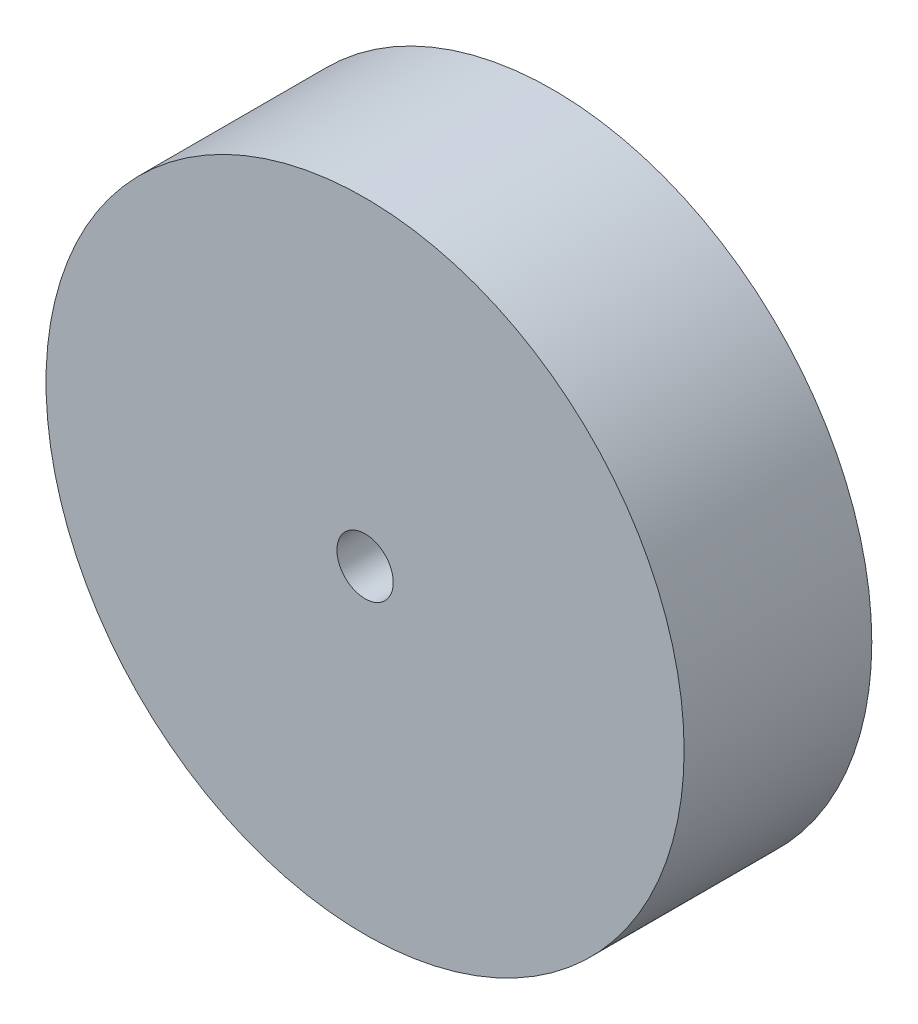
ISO-10303-21;
HEADER;
FILE_DESCRIPTION(('STEP AP214'),'2;1');
FILE_NAME('part.step','',(''),(''),'','','');
FILE_SCHEMA(('AUTOMOTIVE_DESIGN { 1 0 10303 214 1 1 1 1 }'));
ENDSEC;
DATA;
#1=APPLICATION_CONTEXT('core data for automotive mechanical design processes');
#2=APPLICATION_PROTOCOL_DEFINITION('international standard','automotive_design',2000,#1);
#3=PRODUCT_CONTEXT('',#1,'mechanical');
#4=PRODUCT('Part','Part','',(#3));
#5=PRODUCT_RELATED_PRODUCT_CATEGORY('part','',(#4));
#6=PRODUCT_DEFINITION_FORMATION('','',#4);
#7=PRODUCT_DEFINITION_CONTEXT('part definition',#1,'design');
#8=PRODUCT_DEFINITION('design','',#6,#7);
#9=PRODUCT_DEFINITION_SHAPE('','',#8);
#10=(LENGTH_UNIT() NAMED_UNIT(*) SI_UNIT(.MILLI.,.METRE.));
#11=(NAMED_UNIT(*) PLANE_ANGLE_UNIT() SI_UNIT($,.RADIAN.));
#12=(NAMED_UNIT(*) SI_UNIT($,.STERADIAN.) SOLID_ANGLE_UNIT());
#13=UNCERTAINTY_MEASURE_WITH_UNIT(LENGTH_MEASURE(1.E-05),#10,'distance_accuracy_value','');
#14=(GEOMETRIC_REPRESENTATION_CONTEXT(3) GLOBAL_UNCERTAINTY_ASSIGNED_CONTEXT((#13)) GLOBAL_UNIT_ASSIGNED_CONTEXT((#10,
#11,#12)) REPRESENTATION_CONTEXT('',''));
#15=CARTESIAN_POINT('',(0.,0.,0.));
#16=DIRECTION('',(0.,0.,1.));
#17=DIRECTION('',(1.,0.,0.));
#18=AXIS2_PLACEMENT_3D('',#15,#16,#17);
#19=CARTESIAN_POINT('',(0.,0.,10.));
#20=DIRECTION('',(0.,0.,1.));
#21=DIRECTION('',(1.,0.,0.));
#22=AXIS2_PLACEMENT_3D('',#19,#20,#21);
#23=PLANE('',#22);
#24=CARTESIAN_POINT('',(0.,0.,10.));
#25=DIRECTION('',(0.,0.,1.));
#26=DIRECTION('',(1.,0.,0.));
#27=AXIS2_PLACEMENT_3D('',#24,#25,#26);
#28=CIRCLE('',#27,17.);
#29=CARTESIAN_POINT('',(17.,0.,10.));
#30=VERTEX_POINT('',#29);
#31=EDGE_CURVE('E10',#30,#30,#28,.T.);
#32=ORIENTED_EDGE('',*,*,#31,.T.);
#33=EDGE_LOOP('',(#32));
#34=FACE_BOUND('',#33,.T.);
#35=CARTESIAN_POINT('',(0.,0.,10.));
#36=DIRECTION('',(0.,0.,1.));
#37=DIRECTION('',(1.,0.,0.));
#38=AXIS2_PLACEMENT_3D('',#35,#36,#37);
#39=CIRCLE('',#38,1.5);
#40=CARTESIAN_POINT('',(1.5,0.,10.));
#41=VERTEX_POINT('',#40);
#42=EDGE_CURVE('E56',#41,#41,#39,.T.);
#43=ORIENTED_EDGE('',*,*,#42,.F.);
#44=EDGE_LOOP('',(#43));
#45=FACE_BOUND('',#44,.T.);
#46=ADVANCED_FACE('F43',(#34,#45),#23,.T.);
#47=CARTESIAN_POINT('',(0.,0.,0.));
#48=DIRECTION('',(0.,0.,1.));
#49=DIRECTION('',(1.,0.,0.));
#50=AXIS2_PLACEMENT_3D('',#47,#48,#49);
#51=PLANE('',#50);
#52=CARTESIAN_POINT('',(0.,0.,0.));
#53=DIRECTION('',(0.,0.,1.));
#54=DIRECTION('',(1.,0.,0.));
#55=AXIS2_PLACEMENT_3D('',#52,#53,#54);
#56=CIRCLE('',#55,17.);
#57=CARTESIAN_POINT('',(17.,0.,0.));
#58=VERTEX_POINT('',#57);
#59=EDGE_CURVE('E47',#58,#58,#56,.T.);
#60=ORIENTED_EDGE('',*,*,#59,.F.);
#61=EDGE_LOOP('',(#60));
#62=FACE_BOUND('',#61,.T.);
#63=CARTESIAN_POINT('',(0.,0.,0.));
#64=DIRECTION('',(0.,0.,1.));
#65=DIRECTION('',(1.,0.,0.));
#66=AXIS2_PLACEMENT_3D('',#63,#64,#65);
#67=CIRCLE('',#66,1.5);
#68=CARTESIAN_POINT('',(1.5,0.,0.));
#69=VERTEX_POINT('',#68);
#70=EDGE_CURVE('E58',#69,#69,#67,.T.);
#71=ORIENTED_EDGE('',*,*,#70,.T.);
#72=EDGE_LOOP('',(#71));
#73=FACE_BOUND('',#72,.T.);
#74=ADVANCED_FACE('F70',(#62,#73),#51,.F.);
#75=CARTESIAN_POINT('',(0.,0.,10.));
#76=DIRECTION('',(0.,0.,-1.));
#77=DIRECTION('',(-1.,0.,0.));
#78=AXIS2_PLACEMENT_3D('',#75,#76,#77);
#79=CYLINDRICAL_SURFACE('',#78,17.);
#80=ORIENTED_EDGE('',*,*,#31,.F.);
#81=EDGE_LOOP('',(#80));
#82=FACE_BOUND('',#81,.T.);
#83=ORIENTED_EDGE('',*,*,#59,.T.);
#84=EDGE_LOOP('',(#83));
#85=FACE_BOUND('',#84,.T.);
#86=ADVANCED_FACE('F45',(#82,#85),#79,.T.);
#87=CARTESIAN_POINT('',(0.,0.,10.));
#88=DIRECTION('',(0.,0.,-1.));
#89=DIRECTION('',(-1.,0.,0.));
#90=AXIS2_PLACEMENT_3D('',#87,#88,#89);
#91=CYLINDRICAL_SURFACE('',#90,1.5);
#92=ORIENTED_EDGE('',*,*,#42,.T.);
#93=EDGE_LOOP('',(#92));
#94=FACE_BOUND('',#93,.T.);
#95=ORIENTED_EDGE('',*,*,#70,.F.);
#96=EDGE_LOOP('',(#95));
#97=FACE_BOUND('',#96,.T.);
#98=ADVANCED_FACE('F66',(#94,#97),#91,.F.);
#99=CLOSED_SHELL('',(#46,#74,#86,#98));
#100=MANIFOLD_SOLID_BREP('B2',#99);
#101=ADVANCED_BREP_SHAPE_REPRESENTATION('',(#18,#100),#14);
#102=SHAPE_DEFINITION_REPRESENTATION(#9,#101);
ENDSEC;
END-ISO-10303-21;
